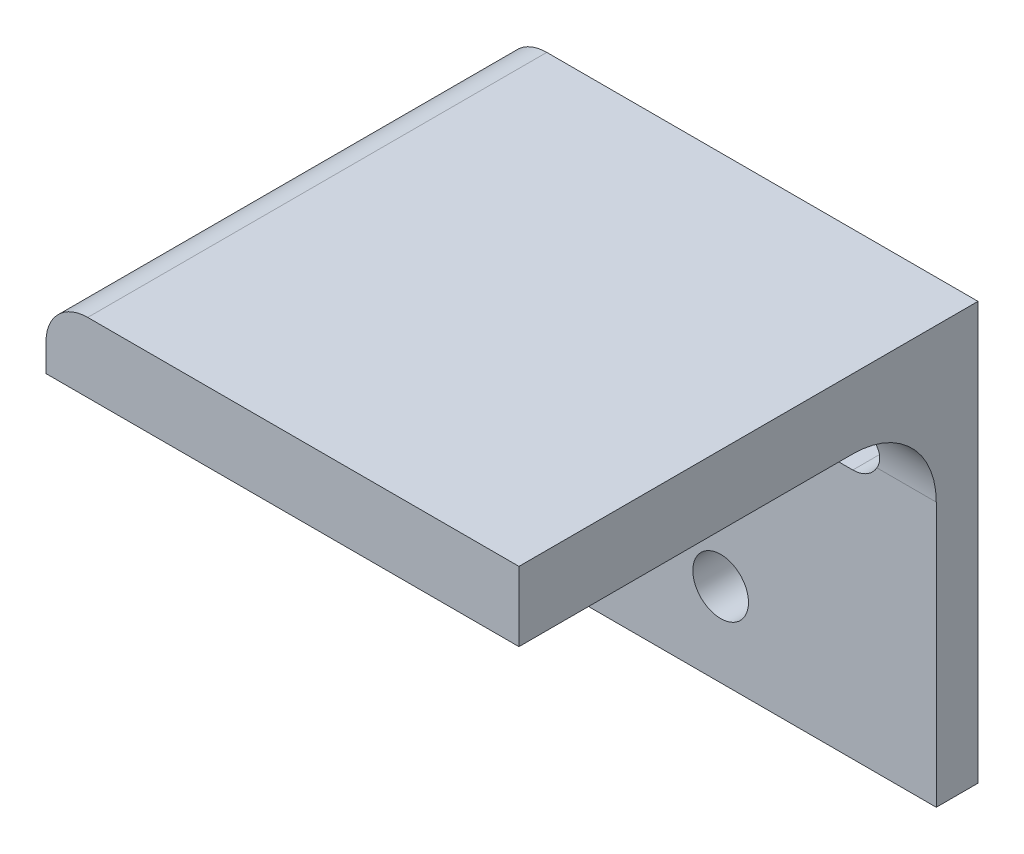
ISO-10303-21;
HEADER;
FILE_DESCRIPTION(('STEP AP214'),'2;1');
FILE_NAME('part.step','',(''),(''),'','','');
FILE_SCHEMA(('AUTOMOTIVE_DESIGN { 1 0 10303 214 1 1 1 1 }'));
ENDSEC;
DATA;
#1=APPLICATION_CONTEXT('core data for automotive mechanical design processes');
#2=APPLICATION_PROTOCOL_DEFINITION('international standard','automotive_design',2000,#1);
#3=PRODUCT_CONTEXT('',#1,'mechanical');
#4=PRODUCT('Part','Part','',(#3));
#5=PRODUCT_RELATED_PRODUCT_CATEGORY('part','',(#4));
#6=PRODUCT_DEFINITION_FORMATION('','',#4);
#7=PRODUCT_DEFINITION_CONTEXT('part definition',#1,'design');
#8=PRODUCT_DEFINITION('design','',#6,#7);
#9=PRODUCT_DEFINITION_SHAPE('','',#8);
#10=(LENGTH_UNIT() NAMED_UNIT(*) SI_UNIT(.MILLI.,.METRE.));
#11=(NAMED_UNIT(*) PLANE_ANGLE_UNIT() SI_UNIT($,.RADIAN.));
#12=(NAMED_UNIT(*) SI_UNIT($,.STERADIAN.) SOLID_ANGLE_UNIT());
#13=UNCERTAINTY_MEASURE_WITH_UNIT(LENGTH_MEASURE(1.E-05),#10,'distance_accuracy_value','');
#14=(GEOMETRIC_REPRESENTATION_CONTEXT(3) GLOBAL_UNCERTAINTY_ASSIGNED_CONTEXT((#13)) GLOBAL_UNIT_ASSIGNED_CONTEXT((#10,
#11,#12)) REPRESENTATION_CONTEXT('',''));
#15=CARTESIAN_POINT('',(0.,0.,0.));
#16=DIRECTION('',(0.,0.,1.));
#17=DIRECTION('',(1.,0.,0.));
#18=AXIS2_PLACEMENT_3D('',#15,#16,#17);
#19=CARTESIAN_POINT('',(-7.99999999999999,28.5,3.));
#20=DIRECTION('',(0.,0.,-1.));
#21=DIRECTION('',(-1.,0.,0.));
#22=AXIS2_PLACEMENT_3D('',#19,#20,#21);
#23=PLANE('',#22);
#24=CARTESIAN_POINT('',(-4.99999999999999,7.5,3.));
#25=DIRECTION('',(0.,0.,1.));
#26=DIRECTION('',(1.,0.,0.));
#27=AXIS2_PLACEMENT_3D('',#24,#25,#26);
#28=CIRCLE('',#27,2.);
#29=CARTESIAN_POINT('',(-2.99999999999999,7.5,3.));
#30=VERTEX_POINT('',#29);
#31=EDGE_CURVE('E198',#30,#30,#28,.T.);
#32=ORIENTED_EDGE('',*,*,#31,.F.);
#33=EDGE_LOOP('',(#32));
#34=FACE_BOUND('',#33,.T.);
#35=CARTESIAN_POINT('',(7.50000000000001,7.5,3.));
#36=DIRECTION('',(0.,0.,1.));
#37=DIRECTION('',(1.,0.,0.));
#38=AXIS2_PLACEMENT_3D('',#35,#36,#37);
#39=CIRCLE('',#38,2.);
#40=CARTESIAN_POINT('',(9.50000000000001,7.5,3.));
#41=VERTEX_POINT('',#40);
#42=EDGE_CURVE('E204',#41,#41,#39,.T.);
#43=ORIENTED_EDGE('',*,*,#42,.F.);
#44=EDGE_LOOP('',(#43));
#45=FACE_BOUND('',#44,.T.);
#46=DIRECTION('',(0.,1.,0.));
#47=VECTOR('',#46,1.);
#48=CARTESIAN_POINT('',(23.,1.5,3.));
#49=LINE('',#48,#47);
#50=CARTESIAN_POINT('',(23.,1.5,3.));
#51=VERTEX_POINT('',#50);
#52=CARTESIAN_POINT('',(23.,20.5,3.));
#53=VERTEX_POINT('',#52);
#54=EDGE_CURVE('E210',#51,#53,#49,.T.);
#55=ORIENTED_EDGE('',*,*,#54,.T.);
#56=DIRECTION('',(-1.,0.,0.));
#57=VECTOR('',#56,1.);
#58=CARTESIAN_POINT('',(-7.99999999999999,20.5,3.));
#59=LINE('',#58,#57);
#60=CARTESIAN_POINT('',(18.7320508075689,20.5,3.));
#61=VERTEX_POINT('',#60);
#62=EDGE_CURVE('E248',#53,#61,#59,.T.);
#63=ORIENTED_EDGE('',*,*,#62,.T.);
#64=CARTESIAN_POINT('',(17.,21.5,3.));
#65=DIRECTION('',(0.,0.,1.));
#66=DIRECTION('',(1.,0.,0.));
#67=AXIS2_PLACEMENT_3D('',#64,#65,#66);
#68=CIRCLE('',#67,2.);
#69=CARTESIAN_POINT('',(17.,19.5,3.));
#70=VERTEX_POINT('',#69);
#71=EDGE_CURVE('E177',#70,#61,#68,.T.);
#72=ORIENTED_EDGE('',*,*,#71,.F.);
#73=DIRECTION('',(1.,0.,0.));
#74=VECTOR('',#73,1.);
#75=CARTESIAN_POINT('',(17.,19.5,3.));
#76=LINE('',#75,#74);
#77=CARTESIAN_POINT('',(14.,19.5,3.));
#78=VERTEX_POINT('',#77);
#79=EDGE_CURVE('E174',#78,#70,#76,.T.);
#80=ORIENTED_EDGE('',*,*,#79,.F.);
#81=CARTESIAN_POINT('',(14.,21.5,3.));
#82=DIRECTION('',(0.,0.,1.));
#83=DIRECTION('',(1.,0.,0.));
#84=AXIS2_PLACEMENT_3D('',#81,#82,#83);
#85=CIRCLE('',#84,2.00000000000001);
#86=CARTESIAN_POINT('',(12.2679491924311,20.5,3.));
#87=VERTEX_POINT('',#86);
#88=EDGE_CURVE('E172',#87,#78,#85,.T.);
#89=ORIENTED_EDGE('',*,*,#88,.F.);
#90=DIRECTION('',(-1.,0.,0.));
#91=VECTOR('',#90,1.);
#92=CARTESIAN_POINT('',(-7.99999999999999,20.5,3.));
#93=LINE('',#92,#91);
#94=CARTESIAN_POINT('',(-11.,20.5,3.));
#95=VERTEX_POINT('',#94);
#96=EDGE_CURVE('E246',#87,#95,#93,.T.);
#97=ORIENTED_EDGE('',*,*,#96,.T.);
#98=DIRECTION('',(0.,-1.,0.));
#99=VECTOR('',#98,1.);
#100=CARTESIAN_POINT('',(-11.,7.50000000000004,3.));
#101=LINE('',#100,#99);
#102=CARTESIAN_POINT('',(-11.,7.5,3.));
#103=VERTEX_POINT('',#102);
#104=EDGE_CURVE('E213',#95,#103,#101,.T.);
#105=ORIENTED_EDGE('',*,*,#104,.T.);
#106=CARTESIAN_POINT('',(-4.99999999999999,7.5,3.));
#107=DIRECTION('',(0.,0.,1.));
#108=DIRECTION('',(-1.,0.,0.));
#109=AXIS2_PLACEMENT_3D('',#106,#107,#108);
#110=CIRCLE('',#109,6.);
#111=CARTESIAN_POINT('',(-4.99999999999995,1.5,3.));
#112=VERTEX_POINT('',#111);
#113=EDGE_CURVE('E216',#103,#112,#110,.T.);
#114=ORIENTED_EDGE('',*,*,#113,.T.);
#115=DIRECTION('',(1.,0.,0.));
#116=VECTOR('',#115,1.);
#117=CARTESIAN_POINT('',(-4.99999999999995,1.5,3.));
#118=LINE('',#117,#116);
#119=EDGE_CURVE('E218',#112,#51,#118,.T.);
#120=ORIENTED_EDGE('',*,*,#119,.T.);
#121=EDGE_LOOP('',(#55,#63,#72,#80,#89,#97,#105,#114,#120));
#122=FACE_BOUND('',#121,.T.);
#123=ADVANCED_FACE('F35',(#34,#45,#122),#23,.F.);
#124=CARTESIAN_POINT('',(-7.99999999999999,28.5,0.));
#125=DIRECTION('',(0.,0.,-1.));
#126=DIRECTION('',(-1.,0.,0.));
#127=AXIS2_PLACEMENT_3D('',#124,#125,#126);
#128=PLANE('',#127);
#129=CARTESIAN_POINT('',(7.50000000000001,7.5,0.));
#130=DIRECTION('',(0.,0.,1.));
#131=DIRECTION('',(1.,0.,0.));
#132=AXIS2_PLACEMENT_3D('',#129,#130,#131);
#133=CIRCLE('',#132,2.);
#134=CARTESIAN_POINT('',(9.50000000000001,7.5,0.));
#135=VERTEX_POINT('',#134);
#136=EDGE_CURVE('E201',#135,#135,#133,.T.);
#137=ORIENTED_EDGE('',*,*,#136,.T.);
#138=EDGE_LOOP('',(#137));
#139=FACE_BOUND('',#138,.T.);
#140=DIRECTION('',(0.,1.,0.));
#141=VECTOR('',#140,1.);
#142=CARTESIAN_POINT('',(23.,1.5,0.));
#143=LINE('',#142,#141);
#144=CARTESIAN_POINT('',(23.,1.5,0.));
#145=VERTEX_POINT('',#144);
#146=CARTESIAN_POINT('',(23.,31.5,0.));
#147=VERTEX_POINT('',#146);
#148=EDGE_CURVE('E207',#145,#147,#143,.T.);
#149=ORIENTED_EDGE('',*,*,#148,.F.);
#150=DIRECTION('',(1.,0.,0.));
#151=VECTOR('',#150,1.);
#152=CARTESIAN_POINT('',(-4.99999999999995,1.5,0.));
#153=LINE('',#152,#151);
#154=CARTESIAN_POINT('',(-4.99999999999995,1.5,0.));
#155=VERTEX_POINT('',#154);
#156=EDGE_CURVE('E214',#155,#145,#153,.T.);
#157=ORIENTED_EDGE('',*,*,#156,.F.);
#158=CARTESIAN_POINT('',(-4.99999999999999,7.5,0.));
#159=DIRECTION('',(0.,0.,1.));
#160=DIRECTION('',(-1.,0.,0.));
#161=AXIS2_PLACEMENT_3D('',#158,#159,#160);
#162=CIRCLE('',#161,6.);
#163=CARTESIAN_POINT('',(-11.,7.5,0.));
#164=VERTEX_POINT('',#163);
#165=EDGE_CURVE('E228',#164,#155,#162,.T.);
#166=ORIENTED_EDGE('',*,*,#165,.F.);
#167=DIRECTION('',(0.,-1.,0.));
#168=VECTOR('',#167,1.);
#169=CARTESIAN_POINT('',(-11.,7.50000000000004,0.));
#170=LINE('',#169,#168);
#171=CARTESIAN_POINT('',(-11.,28.5,0.));
#172=VERTEX_POINT('',#171);
#173=EDGE_CURVE('E226',#172,#164,#170,.T.);
#174=ORIENTED_EDGE('',*,*,#173,.F.);
#175=CARTESIAN_POINT('',(-7.99999999999999,28.5,0.));
#176=DIRECTION('',(0.,0.,1.));
#177=DIRECTION('',(-1.,0.,0.));
#178=AXIS2_PLACEMENT_3D('',#175,#176,#177);
#179=CIRCLE('',#178,3.);
#180=CARTESIAN_POINT('',(-7.99999999999997,31.5,0.));
#181=VERTEX_POINT('',#180);
#182=EDGE_CURVE('E224',#181,#172,#179,.T.);
#183=ORIENTED_EDGE('',*,*,#182,.F.);
#184=DIRECTION('',(-1.,0.,0.));
#185=VECTOR('',#184,1.);
#186=CARTESIAN_POINT('',(-7.99999999999997,31.5,0.));
#187=LINE('',#186,#185);
#188=EDGE_CURVE('E222',#147,#181,#187,.T.);
#189=ORIENTED_EDGE('',*,*,#188,.F.);
#190=EDGE_LOOP('',(#149,#157,#166,#174,#183,#189));
#191=FACE_BOUND('',#190,.T.);
#192=CARTESIAN_POINT('',(-4.99999999999999,7.5,0.));
#193=DIRECTION('',(0.,0.,1.));
#194=DIRECTION('',(1.,0.,0.));
#195=AXIS2_PLACEMENT_3D('',#192,#193,#194);
#196=CIRCLE('',#195,2.);
#197=CARTESIAN_POINT('',(-2.99999999999999,7.5,0.));
#198=VERTEX_POINT('',#197);
#199=EDGE_CURVE('E197',#198,#198,#196,.T.);
#200=ORIENTED_EDGE('',*,*,#199,.T.);
#201=EDGE_LOOP('',(#200));
#202=FACE_BOUND('',#201,.T.);
#203=DIRECTION('',(-1.,0.,0.));
#204=VECTOR('',#203,1.);
#205=CARTESIAN_POINT('',(14.,23.5,0.));
#206=LINE('',#205,#204);
#207=CARTESIAN_POINT('',(17.,23.5,0.));
#208=VERTEX_POINT('',#207);
#209=CARTESIAN_POINT('',(14.,23.5,0.));
#210=VERTEX_POINT('',#209);
#211=EDGE_CURVE('E175',#208,#210,#206,.T.);
#212=ORIENTED_EDGE('',*,*,#211,.T.);
#213=CARTESIAN_POINT('',(14.,21.5,0.));
#214=DIRECTION('',(0.,0.,1.));
#215=DIRECTION('',(1.,0.,0.));
#216=AXIS2_PLACEMENT_3D('',#213,#214,#215);
#217=CIRCLE('',#216,2.00000000000001);
#218=CARTESIAN_POINT('',(14.,19.5,0.));
#219=VERTEX_POINT('',#218);
#220=EDGE_CURVE('E146',#210,#219,#217,.T.);
#221=ORIENTED_EDGE('',*,*,#220,.T.);
#222=DIRECTION('',(1.,0.,0.));
#223=VECTOR('',#222,1.);
#224=CARTESIAN_POINT('',(17.,19.5,0.));
#225=LINE('',#224,#223);
#226=CARTESIAN_POINT('',(17.,19.5,0.));
#227=VERTEX_POINT('',#226);
#228=EDGE_CURVE('E182',#219,#227,#225,.T.);
#229=ORIENTED_EDGE('',*,*,#228,.T.);
#230=CARTESIAN_POINT('',(17.,21.5,0.));
#231=DIRECTION('',(0.,0.,1.));
#232=DIRECTION('',(1.,0.,0.));
#233=AXIS2_PLACEMENT_3D('',#230,#231,#232);
#234=CIRCLE('',#233,2.);
#235=EDGE_CURVE('E185',#227,#208,#234,.T.);
#236=ORIENTED_EDGE('',*,*,#235,.T.);
#237=EDGE_LOOP('',(#212,#221,#229,#236));
#238=FACE_BOUND('',#237,.T.);
#239=ADVANCED_FACE('F302',(#139,#191,#202,#238),#128,.T.);
#240=CARTESIAN_POINT('',(23.,1.5,3.));
#241=DIRECTION('',(-1.,0.,0.));
#242=DIRECTION('',(0.,0.,1.));
#243=AXIS2_PLACEMENT_3D('',#240,#241,#242);
#244=PLANE('',#243);
#245=ORIENTED_EDGE('',*,*,#148,.T.);
#246=DIRECTION('',(0.,0.,-1.));
#247=VECTOR('',#246,1.);
#248=CARTESIAN_POINT('',(23.,31.5,3.));
#249=LINE('',#248,#247);
#250=CARTESIAN_POINT('',(23.,31.5,33.));
#251=VERTEX_POINT('',#250);
#252=EDGE_CURVE('E154',#251,#147,#249,.T.);
#253=ORIENTED_EDGE('',*,*,#252,.F.);
#254=DIRECTION('',(0.,1.,0.));
#255=VECTOR('',#254,1.);
#256=CARTESIAN_POINT('',(23.,0.,33.));
#257=LINE('',#256,#255);
#258=CARTESIAN_POINT('',(23.,26.5,33.));
#259=VERTEX_POINT('',#258);
#260=EDGE_CURVE('E150',#259,#251,#257,.T.);
#261=ORIENTED_EDGE('',*,*,#260,.F.);
#262=DIRECTION('',(0.,0.,-1.));
#263=VECTOR('',#262,1.);
#264=CARTESIAN_POINT('',(23.,26.5,33.));
#265=LINE('',#264,#263);
#266=CARTESIAN_POINT('',(23.,26.5,9.));
#267=VERTEX_POINT('',#266);
#268=EDGE_CURVE('E136',#259,#267,#265,.T.);
#269=ORIENTED_EDGE('',*,*,#268,.T.);
#270=CARTESIAN_POINT('',(23.,20.5,9.));
#271=DIRECTION('',(-1.,0.,0.));
#272=DIRECTION('',(0.,0.,1.));
#273=AXIS2_PLACEMENT_3D('',#270,#271,#272);
#274=CIRCLE('',#273,6.);
#275=EDGE_CURVE('E11',#267,#53,#274,.T.);
#276=ORIENTED_EDGE('',*,*,#275,.T.);
#277=ORIENTED_EDGE('',*,*,#54,.F.);
#278=DIRECTION('',(0.,0.,-1.));
#279=VECTOR('',#278,1.);
#280=CARTESIAN_POINT('',(23.,1.5,3.));
#281=LINE('',#280,#279);
#282=EDGE_CURVE('E220',#51,#145,#281,.T.);
#283=ORIENTED_EDGE('',*,*,#282,.T.);
#284=EDGE_LOOP('',(#245,#253,#261,#269,#276,#277,#283));
#285=FACE_BOUND('',#284,.T.);
#286=ADVANCED_FACE('F152',(#285),#244,.F.);
#287=CARTESIAN_POINT('',(-7.99999999999997,31.5,3.));
#288=DIRECTION('',(0.,-1.,0.));
#289=DIRECTION('',(0.,0.,-1.));
#290=AXIS2_PLACEMENT_3D('',#287,#288,#289);
#291=PLANE('',#290);
#292=ORIENTED_EDGE('',*,*,#188,.T.);
#293=DIRECTION('',(0.,0.,-1.));
#294=VECTOR('',#293,1.);
#295=CARTESIAN_POINT('',(-7.99999999999997,31.5,3.));
#296=LINE('',#295,#294);
#297=CARTESIAN_POINT('',(-7.99999999999997,31.5,33.));
#298=VERTEX_POINT('',#297);
#299=EDGE_CURVE('E242',#298,#181,#296,.T.);
#300=ORIENTED_EDGE('',*,*,#299,.F.);
#301=DIRECTION('',(-1.,0.,0.));
#302=VECTOR('',#301,1.);
#303=CARTESIAN_POINT('',(0.,31.5,33.));
#304=LINE('',#303,#302);
#305=EDGE_CURVE('E158',#251,#298,#304,.T.);
#306=ORIENTED_EDGE('',*,*,#305,.F.);
#307=ORIENTED_EDGE('',*,*,#252,.T.);
#308=EDGE_LOOP('',(#292,#300,#306,#307));
#309=FACE_BOUND('',#308,.T.);
#310=ADVANCED_FACE('F308',(#309),#291,.F.);
#311=CARTESIAN_POINT('',(-7.99999999999999,28.5,3.));
#312=DIRECTION('',(0.,0.,-1.));
#313=DIRECTION('',(-1.,0.,0.));
#314=AXIS2_PLACEMENT_3D('',#311,#312,#313);
#315=CYLINDRICAL_SURFACE('',#314,3.);
#316=ORIENTED_EDGE('',*,*,#182,.T.);
#317=DIRECTION('',(0.,0.,-1.));
#318=VECTOR('',#317,1.);
#319=CARTESIAN_POINT('',(-11.,28.5,3.));
#320=LINE('',#319,#318);
#321=CARTESIAN_POINT('',(-11.,28.5,33.));
#322=VERTEX_POINT('',#321);
#323=EDGE_CURVE('E239',#322,#172,#320,.T.);
#324=ORIENTED_EDGE('',*,*,#323,.F.);
#325=CARTESIAN_POINT('',(-7.99999999999999,28.5,33.));
#326=DIRECTION('',(0.,0.,1.));
#327=DIRECTION('',(1.,0.,0.));
#328=AXIS2_PLACEMENT_3D('',#325,#326,#327);
#329=CIRCLE('',#328,3.);
#330=EDGE_CURVE('E168',#298,#322,#329,.T.);
#331=ORIENTED_EDGE('',*,*,#330,.F.);
#332=ORIENTED_EDGE('',*,*,#299,.T.);
#333=EDGE_LOOP('',(#316,#324,#331,#332));
#334=FACE_BOUND('',#333,.T.);
#335=ADVANCED_FACE('F311',(#334),#315,.T.);
#336=CARTESIAN_POINT('',(-11.,7.50000000000004,3.));
#337=DIRECTION('',(1.,0.,0.));
#338=DIRECTION('',(0.,0.,-1.));
#339=AXIS2_PLACEMENT_3D('',#336,#337,#338);
#340=PLANE('',#339);
#341=ORIENTED_EDGE('',*,*,#173,.T.);
#342=DIRECTION('',(0.,0.,-1.));
#343=VECTOR('',#342,1.);
#344=CARTESIAN_POINT('',(-11.,7.5,3.));
#345=LINE('',#344,#343);
#346=EDGE_CURVE('E236',#103,#164,#345,.T.);
#347=ORIENTED_EDGE('',*,*,#346,.F.);
#348=ORIENTED_EDGE('',*,*,#104,.F.);
#349=CARTESIAN_POINT('',(-11.,20.5,9.));
#350=DIRECTION('',(1.,0.,0.));
#351=DIRECTION('',(0.,0.,-1.));
#352=AXIS2_PLACEMENT_3D('',#349,#350,#351);
#353=CIRCLE('',#352,6.);
#354=CARTESIAN_POINT('',(-11.,26.5,9.));
#355=VERTEX_POINT('',#354);
#356=EDGE_CURVE('E44',#95,#355,#353,.T.);
#357=ORIENTED_EDGE('',*,*,#356,.T.);
#358=DIRECTION('',(0.,0.,-1.));
#359=VECTOR('',#358,1.);
#360=CARTESIAN_POINT('',(-11.,26.5,33.));
#361=LINE('',#360,#359);
#362=CARTESIAN_POINT('',(-11.,26.5,33.));
#363=VERTEX_POINT('',#362);
#364=EDGE_CURVE('E147',#363,#355,#361,.T.);
#365=ORIENTED_EDGE('',*,*,#364,.F.);
#366=DIRECTION('',(0.,-1.,0.));
#367=VECTOR('',#366,1.);
#368=CARTESIAN_POINT('',(-11.,0.,33.));
#369=LINE('',#368,#367);
#370=EDGE_CURVE('E163',#322,#363,#369,.T.);
#371=ORIENTED_EDGE('',*,*,#370,.F.);
#372=ORIENTED_EDGE('',*,*,#323,.T.);
#373=EDGE_LOOP('',(#341,#347,#348,#357,#365,#371,#372));
#374=FACE_BOUND('',#373,.T.);
#375=ADVANCED_FACE('F285',(#374),#340,.F.);
#376=CARTESIAN_POINT('',(-4.99999999999999,7.5,3.));
#377=DIRECTION('',(0.,0.,-1.));
#378=DIRECTION('',(-1.,0.,0.));
#379=AXIS2_PLACEMENT_3D('',#376,#377,#378);
#380=CYLINDRICAL_SURFACE('',#379,6.);
#381=ORIENTED_EDGE('',*,*,#165,.T.);
#382=DIRECTION('',(0.,0.,-1.));
#383=VECTOR('',#382,1.);
#384=CARTESIAN_POINT('',(-4.99999999999995,1.5,3.));
#385=LINE('',#384,#383);
#386=EDGE_CURVE('E233',#112,#155,#385,.T.);
#387=ORIENTED_EDGE('',*,*,#386,.F.);
#388=ORIENTED_EDGE('',*,*,#113,.F.);
#389=ORIENTED_EDGE('',*,*,#346,.T.);
#390=EDGE_LOOP('',(#381,#387,#388,#389));
#391=FACE_BOUND('',#390,.T.);
#392=ADVANCED_FACE('F313',(#391),#380,.T.);
#393=CARTESIAN_POINT('',(-4.99999999999995,1.5,3.));
#394=DIRECTION('',(0.,1.,0.));
#395=DIRECTION('',(0.,0.,1.));
#396=AXIS2_PLACEMENT_3D('',#393,#394,#395);
#397=PLANE('',#396);
#398=ORIENTED_EDGE('',*,*,#156,.T.);
#399=ORIENTED_EDGE('',*,*,#282,.F.);
#400=ORIENTED_EDGE('',*,*,#119,.F.);
#401=ORIENTED_EDGE('',*,*,#386,.T.);
#402=EDGE_LOOP('',(#398,#399,#400,#401));
#403=FACE_BOUND('',#402,.T.);
#404=ADVANCED_FACE('F298',(#403),#397,.F.);
#405=CARTESIAN_POINT('',(7.50000000000001,7.5,3.));
#406=DIRECTION('',(0.,0.,-1.));
#407=DIRECTION('',(-1.,0.,0.));
#408=AXIS2_PLACEMENT_3D('',#405,#406,#407);
#409=CYLINDRICAL_SURFACE('',#408,2.);
#410=ORIENTED_EDGE('',*,*,#42,.T.);
#411=EDGE_LOOP('',(#410));
#412=FACE_BOUND('',#411,.T.);
#413=ORIENTED_EDGE('',*,*,#136,.F.);
#414=EDGE_LOOP('',(#413));
#415=FACE_BOUND('',#414,.T.);
#416=ADVANCED_FACE('F320',(#412,#415),#409,.F.);
#417=CARTESIAN_POINT('',(-4.99999999999999,7.5,3.));
#418=DIRECTION('',(0.,0.,-1.));
#419=DIRECTION('',(-1.,0.,0.));
#420=AXIS2_PLACEMENT_3D('',#417,#418,#419);
#421=CYLINDRICAL_SURFACE('',#420,2.);
#422=ORIENTED_EDGE('',*,*,#31,.T.);
#423=EDGE_LOOP('',(#422));
#424=FACE_BOUND('',#423,.T.);
#425=ORIENTED_EDGE('',*,*,#199,.F.);
#426=EDGE_LOOP('',(#425));
#427=FACE_BOUND('',#426,.T.);
#428=ADVANCED_FACE('F276',(#424,#427),#421,.F.);
#429=CARTESIAN_POINT('',(14.,21.5,3.));
#430=DIRECTION('',(0.,0.,-1.));
#431=DIRECTION('',(-1.,0.,0.));
#432=AXIS2_PLACEMENT_3D('',#429,#430,#431);
#433=CYLINDRICAL_SURFACE('',#432,2.00000000000001);
#434=ORIENTED_EDGE('',*,*,#220,.F.);
#435=DIRECTION('',(0.,0.,-1.));
#436=VECTOR('',#435,1.);
#437=CARTESIAN_POINT('',(14.,23.5,3.));
#438=LINE('',#437,#436);
#439=CARTESIAN_POINT('',(14.,23.5,3.80384757729338));
#440=VERTEX_POINT('',#439);
#441=EDGE_CURVE('E51',#440,#210,#438,.T.);
#442=ORIENTED_EDGE('',*,*,#441,.F.);
#443=CARTESIAN_POINT('',(14.,23.5,3.80384757729338));
#444=CARTESIAN_POINT('',(13.9480850204428,23.5000092183006,3.80385933908343));
#445=CARTESIAN_POINT('',(13.8961773290675,23.497978919495,3.80268084633315));
#446=CARTESIAN_POINT('',(13.7928038783913,23.4899111644431,3.79803204578961));
#447=CARTESIAN_POINT('',(13.7413379031536,23.4838757942027,3.79456293105114));
#448=CARTESIAN_POINT('',(13.6394937427592,23.4679124853733,3.78544588229565));
#449=CARTESIAN_POINT('',(13.5891112088274,23.4580055608617,3.77980971326625));
#450=CARTESIAN_POINT('',(13.4895153711401,23.434432109994,3.76652211238838));
#451=CARTESIAN_POINT('',(13.4403021731581,23.4207652449241,3.75887049898148));
#452=CARTESIAN_POINT('',(13.2950777187307,23.3744002562283,3.73320978761105));
#453=CARTESIAN_POINT('',(13.2012111292307,23.336294403285,3.71246898997687));
#454=CARTESIAN_POINT('',(13.02131310021,23.2470810966342,3.66557648206939));
#455=CARTESIAN_POINT('',(12.9352923001702,23.1959563341371,3.63941757706955));
#456=CARTESIAN_POINT('',(12.766481909246,23.077911614891,3.58160577092626));
#457=CARTESIAN_POINT('',(12.6844049468518,23.0101015023939,3.54968931009415));
#458=CARTESIAN_POINT('',(12.5323149817378,22.862763279321,3.48421800136092));
#459=CARTESIAN_POINT('',(12.4623060944591,22.7832311884135,3.45066259953662));
#460=CARTESIAN_POINT('',(12.3292196000004,22.6054513188173,3.38065143368487));
#461=CARTESIAN_POINT('',(12.2675481061122,22.5061255951427,3.34424354302375));
#462=CARTESIAN_POINT('',(12.1621043920248,22.2973761976002,3.27448350035022));
#463=CARTESIAN_POINT('',(12.1183323268501,22.1879524362844,3.24113137480533));
#464=CARTESIAN_POINT('',(12.0507139190508,21.9626101498829,3.17983773377776));
#465=CARTESIAN_POINT('',(12.0267171526105,21.8467479484883,3.15185663809201));
#466=CARTESIAN_POINT('',(11.999583623043,21.6111980006543,3.10256965378062));
#467=CARTESIAN_POINT('',(11.9964392877006,21.4915116587543,3.08126134472139));
#468=CARTESIAN_POINT('',(12.0112045842782,21.2611703831943,3.04742118479284));
#469=CARTESIAN_POINT('',(12.0275968184682,21.1504928254681,3.03436297115096));
#470=CARTESIAN_POINT('',(12.0788244081919,20.9329677950814,3.01464907026875));
#471=CARTESIAN_POINT('',(12.1136345997971,20.826115308487,3.00798468219344));
#472=CARTESIAN_POINT('',(12.1732569568968,20.6846782941824,3.0027187311439));
#473=CARTESIAN_POINT('',(12.1905981798911,20.6468892069877,3.00168223719079));
#474=CARTESIAN_POINT('',(12.2275703531365,20.5725256730144,3.00032388253986));
#475=CARTESIAN_POINT('',(12.24719682175,20.5359490237068,3.00000064710309));
#476=CARTESIAN_POINT('',(12.2679491924311,20.5,2.99999999999999));
#477=B_SPLINE_CURVE_WITH_KNOTS('',3,(#443,#444,#445,#446,#447,#448,#449,#450,#451,#452,#453,
#454,#455,#456,#457,#458,#459,#460,#461,#462,#463,#464,#465,#466,#467,#468,#469,#470,#471,#472,
#473,#474,#475,#476),.UNSPECIFIED.,.F.,.F.,(4,2,2,2,2,2,2,2,2,2,2,2,2,2,2,2,4),(0.,
0.155679877223585,0.311278733541249,0.466044503334841,0.620824219753495,0.929568696268089,
1.23872581494558,1.57080834229159,1.9030038929597,2.26862323731729,2.6342457481887,
2.99706073302873,3.35974396039479,3.6960003685931,4.03179854113302,4.15650529449496,
4.28097147655621),.UNSPECIFIED.);
#478=EDGE_CURVE('E278',#440,#87,#477,.T.);
#479=ORIENTED_EDGE('',*,*,#478,.T.);
#480=ORIENTED_EDGE('',*,*,#88,.T.);
#481=DIRECTION('',(0.,0.,-1.));
#482=VECTOR('',#481,1.);
#483=CARTESIAN_POINT('',(14.,19.5,3.));
#484=LINE('',#483,#482);
#485=EDGE_CURVE('E194',#78,#219,#484,.T.);
#486=ORIENTED_EDGE('',*,*,#485,.T.);
#487=EDGE_LOOP('',(#434,#442,#479,#480,#486));
#488=FACE_BOUND('',#487,.T.);
#489=ADVANCED_FACE('F271',(#488),#433,.F.);
#490=CARTESIAN_POINT('',(17.,19.5,3.));
#491=DIRECTION('',(0.,1.,0.));
#492=DIRECTION('',(-1.,0.,0.));
#493=AXIS2_PLACEMENT_3D('',#490,#491,#492);
#494=PLANE('',#493);
#495=ORIENTED_EDGE('',*,*,#228,.F.);
#496=ORIENTED_EDGE('',*,*,#485,.F.);
#497=ORIENTED_EDGE('',*,*,#79,.T.);
#498=DIRECTION('',(0.,0.,-1.));
#499=VECTOR('',#498,1.);
#500=CARTESIAN_POINT('',(17.,19.5,3.));
#501=LINE('',#500,#499);
#502=EDGE_CURVE('E192',#70,#227,#501,.T.);
#503=ORIENTED_EDGE('',*,*,#502,.T.);
#504=EDGE_LOOP('',(#495,#496,#497,#503));
#505=FACE_BOUND('',#504,.T.);
#506=ADVANCED_FACE('F266',(#505),#494,.T.);
#507=CARTESIAN_POINT('',(17.,21.5,3.));
#508=DIRECTION('',(0.,0.,-1.));
#509=DIRECTION('',(-1.,0.,0.));
#510=AXIS2_PLACEMENT_3D('',#507,#508,#509);
#511=CYLINDRICAL_SURFACE('',#510,2.);
#512=ORIENTED_EDGE('',*,*,#235,.F.);
#513=ORIENTED_EDGE('',*,*,#502,.F.);
#514=ORIENTED_EDGE('',*,*,#71,.T.);
#515=CARTESIAN_POINT('',(18.7320508075689,20.5,3.));
#516=CARTESIAN_POINT('',(18.7590836599133,20.5468094384814,2.99999545233269));
#517=CARTESIAN_POINT('',(18.784207762467,20.5947212366887,3.00054765957825));
#518=CARTESIAN_POINT('',(18.8304887359896,20.6923954561681,3.00288766521989));
#519=CARTESIAN_POINT('',(18.8516455580671,20.7421579002378,3.0046754788419));
#520=CARTESIAN_POINT('',(18.8898096139181,20.8430936401758,3.0096046579649));
#521=CARTESIAN_POINT('',(18.9068237307614,20.8942644363978,3.01274375396126));
#522=CARTESIAN_POINT('',(18.9366443089804,20.9976952091521,3.02045182755773));
#523=CARTESIAN_POINT('',(18.9494509546345,21.0499551378762,3.02502074251761));
#524=CARTESIAN_POINT('',(18.9814586821605,21.2078819727821,3.04096950939012));
#525=CARTESIAN_POINT('',(18.9942511187744,21.314705406066,3.05459181471912));
#526=CARTESIAN_POINT('',(19.002655718478,21.528018599027,3.08773690311038));
#527=CARTESIAN_POINT('',(18.9982696955705,21.6345083927471,3.10725906296169));
#528=CARTESIAN_POINT('',(18.9728650244218,21.8451681919579,3.15173567158913));
#529=CARTESIAN_POINT('',(18.9517198336373,21.9493143239217,3.17673039841117));
#530=CARTESIAN_POINT('',(18.8936883265987,22.1519740550677,3.23094410544187));
#531=CARTESIAN_POINT('',(18.8567946647276,22.2504850014636,3.26016505269149));
#532=CARTESIAN_POINT('',(18.7657192212862,22.4458158027922,3.32329433961596));
#533=CARTESIAN_POINT('',(18.7105943502319,22.5421377172845,3.35738203639886));
#534=CARTESIAN_POINT('',(18.5854468902296,22.7241615020881,3.42661640400188));
#535=CARTESIAN_POINT('',(18.5154179785857,22.8098588406734,3.46176351880675));
#536=CARTESIAN_POINT('',(18.3571425281301,22.9737434009781,3.53291149819702));
#537=CARTESIAN_POINT('',(18.2680398696934,23.051143488673,3.56883171536995));
#538=CARTESIAN_POINT('',(18.0764336413088,23.1897582315828,3.63612547949762));
#539=CARTESIAN_POINT('',(17.9739269470526,23.250969103214,3.6674979628281));
#540=CARTESIAN_POINT('',(17.7613581672632,23.3530293625974,3.72141337294772));
#541=CARTESIAN_POINT('',(17.6516626895469,23.3944904326005,3.74421616479613));
#542=CARTESIAN_POINT('',(17.4820771397256,23.4419214188856,3.77071581685225));
#543=CARTESIAN_POINT('',(17.4247538683779,23.4552670779864,3.77826211875852));
#544=CARTESIAN_POINT('',(17.3088765011266,23.4768807443406,3.79055279943829));
#545=CARTESIAN_POINT('',(17.2503233865174,23.485152651835,3.79529933031446));
#546=CARTESIAN_POINT('',(17.1596564675112,23.4938738311861,3.80031438960761));
#547=CARTESIAN_POINT('',(17.1277640186739,23.4961711297516,3.80163840700319));
#548=CARTESIAN_POINT('',(17.0639164778685,23.499233554255,3.80340499479862));
#549=CARTESIAN_POINT('',(17.0319614930894,23.5000003592568,3.80384853114801));
#550=CARTESIAN_POINT('',(17.,23.5,3.80384757729338));
#551=B_SPLINE_CURVE_WITH_KNOTS('',3,(#515,#516,#517,#518,#519,#520,#521,#522,#523,#524,#525,
#526,#527,#528,#529,#530,#531,#532,#533,#534,#535,#536,#537,#538,#539,#540,#541,#542,#543,#544,
#545,#546,#547,#548,#549,#550),.UNSPECIFIED.,.F.,.F.,(4,2,2,2,2,2,2,2,2,2,2,2,2,2,2,2,2,4),(0.,
0.162115841370044,0.324233680468407,0.486080295422835,0.647919820884719,0.971568854607236,
1.29518371271437,1.62126562192807,1.94749979320642,2.29429623930134,2.64124010010512,
3.00954277999323,3.37793146003565,3.73401837841206,3.91179088947619,4.08942657329706,
4.18539131521117,4.28125071875339),.UNSPECIFIED.);
#552=CARTESIAN_POINT('',(17.,23.5,3.80384757729338));
#553=VERTEX_POINT('',#552);
#554=EDGE_CURVE('E252',#61,#553,#551,.T.);
#555=ORIENTED_EDGE('',*,*,#554,.T.);
#556=DIRECTION('',(0.,0.,-1.));
#557=VECTOR('',#556,1.);
#558=CARTESIAN_POINT('',(17.,23.5,3.));
#559=LINE('',#558,#557);
#560=EDGE_CURVE('E58',#553,#208,#559,.T.);
#561=ORIENTED_EDGE('',*,*,#560,.T.);
#562=EDGE_LOOP('',(#512,#513,#514,#555,#561));
#563=FACE_BOUND('',#562,.T.);
#564=ADVANCED_FACE('F260',(#563),#511,.F.);
#565=CARTESIAN_POINT('',(14.,23.5,3.));
#566=DIRECTION('',(0.,-1.,0.));
#567=DIRECTION('',(1.,0.,0.));
#568=AXIS2_PLACEMENT_3D('',#565,#566,#567);
#569=PLANE('',#568);
#570=ORIENTED_EDGE('',*,*,#211,.F.);
#571=ORIENTED_EDGE('',*,*,#560,.F.);
#572=DIRECTION('',(-1.,0.,0.));
#573=VECTOR('',#572,1.);
#574=CARTESIAN_POINT('',(17.,23.5,3.80384757729338));
#575=LINE('',#574,#573);
#576=EDGE_CURVE('E258',#553,#440,#575,.T.);
#577=ORIENTED_EDGE('',*,*,#576,.T.);
#578=ORIENTED_EDGE('',*,*,#441,.T.);
#579=EDGE_LOOP('',(#570,#571,#577,#578));
#580=FACE_BOUND('',#579,.T.);
#581=ADVANCED_FACE('F265',(#580),#569,.T.);
#582=CARTESIAN_POINT('',(0.,26.5,33.));
#583=DIRECTION('',(0.,-1.,0.));
#584=DIRECTION('',(1.,0.,0.));
#585=AXIS2_PLACEMENT_3D('',#582,#583,#584);
#586=PLANE('',#585);
#587=ORIENTED_EDGE('',*,*,#364,.T.);
#588=DIRECTION('',(-1.,0.,0.));
#589=VECTOR('',#588,1.);
#590=CARTESIAN_POINT('',(0.,26.5,9.));
#591=LINE('',#590,#589);
#592=EDGE_CURVE('E143',#355,#267,#591,.F.);
#593=ORIENTED_EDGE('',*,*,#592,.T.);
#594=ORIENTED_EDGE('',*,*,#268,.F.);
#595=DIRECTION('',(-1.,0.,0.));
#596=VECTOR('',#595,1.);
#597=CARTESIAN_POINT('',(0.,26.5,33.));
#598=LINE('',#597,#596);
#599=EDGE_CURVE('E141',#259,#363,#598,.T.);
#600=ORIENTED_EDGE('',*,*,#599,.T.);
#601=EDGE_LOOP('',(#587,#593,#594,#600));
#602=FACE_BOUND('',#601,.T.);
#603=ADVANCED_FACE('F139',(#602),#586,.T.);
#604=CARTESIAN_POINT('',(0.,0.,33.));
#605=DIRECTION('',(0.,0.,1.));
#606=DIRECTION('',(1.,0.,0.));
#607=AXIS2_PLACEMENT_3D('',#604,#605,#606);
#608=PLANE('',#607);
#609=ORIENTED_EDGE('',*,*,#599,.F.);
#610=ORIENTED_EDGE('',*,*,#260,.T.);
#611=ORIENTED_EDGE('',*,*,#305,.T.);
#612=ORIENTED_EDGE('',*,*,#330,.T.);
#613=ORIENTED_EDGE('',*,*,#370,.T.);
#614=EDGE_LOOP('',(#609,#610,#611,#612,#613));
#615=FACE_BOUND('',#614,.T.);
#616=ADVANCED_FACE('F160',(#615),#608,.T.);
#617=CARTESIAN_POINT('',(-7.99999999999999,20.5,9.));
#618=DIRECTION('',(-1.,0.,0.));
#619=DIRECTION('',(0.,-1.,0.));
#620=AXIS2_PLACEMENT_3D('',#617,#618,#619);
#621=CYLINDRICAL_SURFACE('',#620,6.);
#622=ORIENTED_EDGE('',*,*,#275,.F.);
#623=ORIENTED_EDGE('',*,*,#592,.F.);
#624=ORIENTED_EDGE('',*,*,#356,.F.);
#625=ORIENTED_EDGE('',*,*,#96,.F.);
#626=ORIENTED_EDGE('',*,*,#478,.F.);
#627=ORIENTED_EDGE('',*,*,#576,.F.);
#628=ORIENTED_EDGE('',*,*,#554,.F.);
#629=ORIENTED_EDGE('',*,*,#62,.F.);
#630=EDGE_LOOP('',(#622,#623,#624,#625,#626,#627,#628,#629));
#631=FACE_BOUND('',#630,.T.);
#632=ADVANCED_FACE('F37',(#631),#621,.F.);
#633=CLOSED_SHELL('',(#123,#239,#286,#310,#335,#375,#392,#404,#416,#428,#489,#506,#564,#581,
#603,#616,#632));
#634=MANIFOLD_SOLID_BREP('B2',#633);
#635=ADVANCED_BREP_SHAPE_REPRESENTATION('',(#18,#634),#14);
#636=SHAPE_DEFINITION_REPRESENTATION(#9,#635);
ENDSEC;
END-ISO-10303-21;
